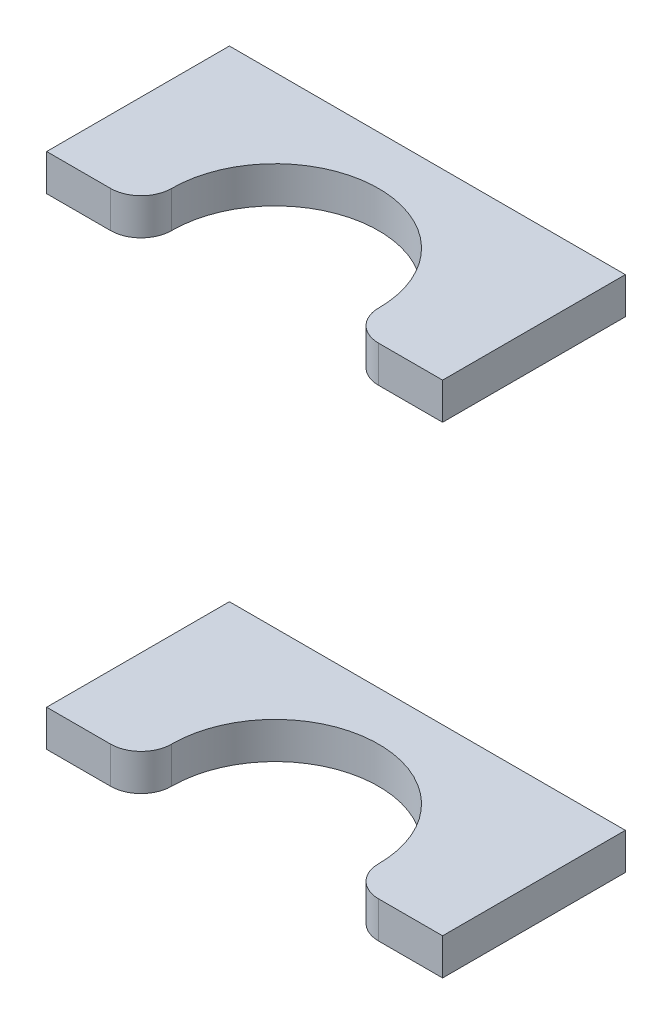
ISO-10303-21;
HEADER;
FILE_DESCRIPTION(('STEP AP214'),'2;1');
FILE_NAME('part.step','',(''),(''),'','','');
FILE_SCHEMA(('AUTOMOTIVE_DESIGN { 1 0 10303 214 1 1 1 1 }'));
ENDSEC;
DATA;
#1=APPLICATION_CONTEXT('core data for automotive mechanical design processes');
#2=APPLICATION_PROTOCOL_DEFINITION('international standard','automotive_design',2000,#1);
#3=PRODUCT_CONTEXT('',#1,'mechanical');
#4=PRODUCT('Part','Part','',(#3));
#5=PRODUCT_RELATED_PRODUCT_CATEGORY('part','',(#4));
#6=PRODUCT_DEFINITION_FORMATION('','',#4);
#7=PRODUCT_DEFINITION_CONTEXT('part definition',#1,'design');
#8=PRODUCT_DEFINITION('design','',#6,#7);
#9=PRODUCT_DEFINITION_SHAPE('','',#8);
#10=(LENGTH_UNIT() NAMED_UNIT(*) SI_UNIT(.MILLI.,.METRE.));
#11=(NAMED_UNIT(*) PLANE_ANGLE_UNIT() SI_UNIT($,.RADIAN.));
#12=(NAMED_UNIT(*) SI_UNIT($,.STERADIAN.) SOLID_ANGLE_UNIT());
#13=UNCERTAINTY_MEASURE_WITH_UNIT(LENGTH_MEASURE(1.E-05),#10,'distance_accuracy_value','');
#14=(GEOMETRIC_REPRESENTATION_CONTEXT(3) GLOBAL_UNCERTAINTY_ASSIGNED_CONTEXT((#13)) GLOBAL_UNIT_ASSIGNED_CONTEXT((#10,
#11,#12)) REPRESENTATION_CONTEXT('',''));
#15=CARTESIAN_POINT('',(0.,0.,0.));
#16=DIRECTION('',(0.,0.,1.));
#17=DIRECTION('',(1.,0.,0.));
#18=AXIS2_PLACEMENT_3D('',#15,#16,#17);
#19=CARTESIAN_POINT('',(-319.,105.,109.276335681472));
#20=DIRECTION('',(-1.,0.,0.));
#21=DIRECTION('',(0.,0.,1.));
#22=AXIS2_PLACEMENT_3D('',#19,#20,#21);
#23=PLANE('',#22);
#24=DIRECTION('',(0.,0.,-1.));
#25=VECTOR('',#24,1.);
#26=CARTESIAN_POINT('',(-319.,105.,109.276335681472));
#27=LINE('',#26,#25);
#28=CARTESIAN_POINT('',(-319.,105.,30.0000000000017));
#29=VERTEX_POINT('',#28);
#30=CARTESIAN_POINT('',(-319.,105.,0.));
#31=VERTEX_POINT('',#30);
#32=EDGE_CURVE('E82',#29,#31,#27,.T.);
#33=ORIENTED_EDGE('',*,*,#32,.F.);
#34=DIRECTION('',(0.,-1.,0.));
#35=VECTOR('',#34,1.);
#36=CARTESIAN_POINT('',(-319.,105.,30.0000000000017));
#37=LINE('',#36,#35);
#38=CARTESIAN_POINT('',(-319.,99.,30.0000000000017));
#39=VERTEX_POINT('',#38);
#40=EDGE_CURVE('E135',#29,#39,#37,.T.);
#41=ORIENTED_EDGE('',*,*,#40,.T.);
#42=DIRECTION('',(0.,0.,-1.));
#43=VECTOR('',#42,1.);
#44=CARTESIAN_POINT('',(-319.,99.,109.276335681472));
#45=LINE('',#44,#43);
#46=CARTESIAN_POINT('',(-319.,99.,0.));
#47=VERTEX_POINT('',#46);
#48=EDGE_CURVE('E90',#39,#47,#45,.T.);
#49=ORIENTED_EDGE('',*,*,#48,.T.);
#50=DIRECTION('',(0.,1.,0.));
#51=VECTOR('',#50,1.);
#52=CARTESIAN_POINT('',(-319.,105.,0.));
#53=LINE('',#52,#51);
#54=EDGE_CURVE('E184',#47,#31,#53,.T.);
#55=ORIENTED_EDGE('',*,*,#54,.T.);
#56=EDGE_LOOP('',(#33,#41,#49,#55));
#57=FACE_BOUND('',#56,.T.);
#58=ADVANCED_FACE('F46',(#57),#23,.F.);
#59=CARTESIAN_POINT('',(-319.,105.,109.276335681472));
#60=DIRECTION('',(0.,-1.,0.));
#61=DIRECTION('',(1.,0.,0.));
#62=AXIS2_PLACEMENT_3D('',#59,#60,#61);
#63=PLANE('',#62);
#64=DIRECTION('',(0.,0.,-1.));
#65=VECTOR('',#64,1.);
#66=CARTESIAN_POINT('',(-384.,105.,109.276335681472));
#67=LINE('',#66,#65);
#68=CARTESIAN_POINT('',(-384.,105.,30.0000000000017));
#69=VERTEX_POINT('',#68);
#70=CARTESIAN_POINT('',(-384.,105.,0.));
#71=VERTEX_POINT('',#70);
#72=EDGE_CURVE('E180',#69,#71,#67,.T.);
#73=ORIENTED_EDGE('',*,*,#72,.F.);
#74=DIRECTION('',(1.,0.,0.));
#75=VECTOR('',#74,1.);
#76=CARTESIAN_POINT('',(-373.5,105.,30.0000000000017));
#77=LINE('',#76,#75);
#78=CARTESIAN_POINT('',(-373.5,105.,30.0000000000017));
#79=VERTEX_POINT('',#78);
#80=EDGE_CURVE('E141',#69,#79,#77,.T.);
#81=ORIENTED_EDGE('',*,*,#80,.T.);
#82=CARTESIAN_POINT('',(-373.5,105.,25.0000000000017));
#83=DIRECTION('',(0.,1.,0.));
#84=DIRECTION('',(1.,0.,0.));
#85=AXIS2_PLACEMENT_3D('',#82,#83,#84);
#86=CIRCLE('',#85,4.99999999999998);
#87=CARTESIAN_POINT('',(-368.5,105.,25.0000000000017));
#88=VERTEX_POINT('',#87);
#89=EDGE_CURVE('E154',#79,#88,#86,.T.);
#90=ORIENTED_EDGE('',*,*,#89,.T.);
#91=CARTESIAN_POINT('',(-351.5,105.,25.0000000000017));
#92=DIRECTION('',(0.,-1.,0.));
#93=DIRECTION('',(1.,0.,0.));
#94=AXIS2_PLACEMENT_3D('',#91,#92,#93);
#95=CIRCLE('',#94,17.);
#96=CARTESIAN_POINT('',(-334.5,105.,25.0000000000017));
#97=VERTEX_POINT('',#96);
#98=EDGE_CURVE('E136',#88,#97,#95,.T.);
#99=ORIENTED_EDGE('',*,*,#98,.T.);
#100=CARTESIAN_POINT('',(-329.5,105.,25.0000000000017));
#101=DIRECTION('',(0.,1.,0.));
#102=DIRECTION('',(-1.,0.,0.));
#103=AXIS2_PLACEMENT_3D('',#100,#101,#102);
#104=CIRCLE('',#103,4.99999999999998);
#105=CARTESIAN_POINT('',(-329.5,105.,30.0000000000017));
#106=VERTEX_POINT('',#105);
#107=EDGE_CURVE('E129',#97,#106,#104,.T.);
#108=ORIENTED_EDGE('',*,*,#107,.T.);
#109=DIRECTION('',(1.,0.,0.));
#110=VECTOR('',#109,1.);
#111=CARTESIAN_POINT('',(-329.5,105.,30.0000000000017));
#112=LINE('',#111,#110);
#113=EDGE_CURVE('E138',#106,#29,#112,.T.);
#114=ORIENTED_EDGE('',*,*,#113,.T.);
#115=ORIENTED_EDGE('',*,*,#32,.T.);
#116=DIRECTION('',(-1.,0.,0.));
#117=VECTOR('',#116,1.);
#118=CARTESIAN_POINT('',(-319.,105.,0.));
#119=LINE('',#118,#117);
#120=EDGE_CURVE('E181',#31,#71,#119,.T.);
#121=ORIENTED_EDGE('',*,*,#120,.T.);
#122=EDGE_LOOP('',(#73,#81,#90,#99,#108,#114,#115,#121));
#123=FACE_BOUND('',#122,.T.);
#124=ADVANCED_FACE('F144',(#123),#63,.F.);
#125=CARTESIAN_POINT('',(-384.,105.,109.276335681472));
#126=DIRECTION('',(1.,0.,0.));
#127=DIRECTION('',(0.,1.,0.));
#128=AXIS2_PLACEMENT_3D('',#125,#126,#127);
#129=PLANE('',#128);
#130=DIRECTION('',(0.,0.,-1.));
#131=VECTOR('',#130,1.);
#132=CARTESIAN_POINT('',(-384.,99.,109.276335681472));
#133=LINE('',#132,#131);
#134=CARTESIAN_POINT('',(-384.,99.,30.0000000000017));
#135=VERTEX_POINT('',#134);
#136=CARTESIAN_POINT('',(-384.,99.,0.));
#137=VERTEX_POINT('',#136);
#138=EDGE_CURVE('E69',#135,#137,#133,.T.);
#139=ORIENTED_EDGE('',*,*,#138,.F.);
#140=DIRECTION('',(0.,-1.,0.));
#141=VECTOR('',#140,1.);
#142=CARTESIAN_POINT('',(-384.,105.,30.0000000000017));
#143=LINE('',#142,#141);
#144=EDGE_CURVE('E168',#69,#135,#143,.T.);
#145=ORIENTED_EDGE('',*,*,#144,.F.);
#146=ORIENTED_EDGE('',*,*,#72,.T.);
#147=DIRECTION('',(0.,-1.,0.));
#148=VECTOR('',#147,1.);
#149=CARTESIAN_POINT('',(-384.,105.,0.));
#150=LINE('',#149,#148);
#151=EDGE_CURVE('E177',#71,#137,#150,.T.);
#152=ORIENTED_EDGE('',*,*,#151,.T.);
#153=EDGE_LOOP('',(#139,#145,#146,#152));
#154=FACE_BOUND('',#153,.T.);
#155=ADVANCED_FACE('F211',(#154),#129,.F.);
#156=CARTESIAN_POINT('',(-319.,99.,109.276335681472));
#157=DIRECTION('',(0.,1.,0.));
#158=DIRECTION('',(-1.,0.,0.));
#159=AXIS2_PLACEMENT_3D('',#156,#157,#158);
#160=PLANE('',#159);
#161=CARTESIAN_POINT('',(-373.5,99.,25.0000000000017));
#162=DIRECTION('',(0.,1.,0.));
#163=DIRECTION('',(-1.,0.,0.));
#164=AXIS2_PLACEMENT_3D('',#161,#162,#163);
#165=CIRCLE('',#164,4.99999999999998);
#166=CARTESIAN_POINT('',(-368.5,99.,25.0000000000017));
#167=VERTEX_POINT('',#166);
#168=CARTESIAN_POINT('',(-373.5,99.,30.0000000000017));
#169=VERTEX_POINT('',#168);
#170=EDGE_CURVE('E54',#167,#169,#165,.F.);
#171=ORIENTED_EDGE('',*,*,#170,.T.);
#172=DIRECTION('',(-1.,0.,0.));
#173=VECTOR('',#172,1.);
#174=CARTESIAN_POINT('',(-319.,99.,30.0000000000017));
#175=LINE('',#174,#173);
#176=EDGE_CURVE('E12',#169,#135,#175,.T.);
#177=ORIENTED_EDGE('',*,*,#176,.T.);
#178=ORIENTED_EDGE('',*,*,#138,.T.);
#179=DIRECTION('',(1.,0.,0.));
#180=VECTOR('',#179,1.);
#181=CARTESIAN_POINT('',(-319.,99.,0.));
#182=LINE('',#181,#180);
#183=EDGE_CURVE('E173',#137,#47,#182,.T.);
#184=ORIENTED_EDGE('',*,*,#183,.T.);
#185=ORIENTED_EDGE('',*,*,#48,.F.);
#186=DIRECTION('',(-1.,0.,0.));
#187=VECTOR('',#186,1.);
#188=CARTESIAN_POINT('',(-319.,99.,30.0000000000017));
#189=LINE('',#188,#187);
#190=CARTESIAN_POINT('',(-329.5,99.,30.0000000000017));
#191=VERTEX_POINT('',#190);
#192=EDGE_CURVE('E176',#39,#191,#189,.T.);
#193=ORIENTED_EDGE('',*,*,#192,.T.);
#194=CARTESIAN_POINT('',(-329.5,99.,25.0000000000017));
#195=DIRECTION('',(0.,1.,0.));
#196=DIRECTION('',(-1.,0.,0.));
#197=AXIS2_PLACEMENT_3D('',#194,#195,#196);
#198=CIRCLE('',#197,4.99999999999998);
#199=CARTESIAN_POINT('',(-334.5,99.,25.0000000000017));
#200=VERTEX_POINT('',#199);
#201=EDGE_CURVE('E132',#191,#200,#198,.F.);
#202=ORIENTED_EDGE('',*,*,#201,.T.);
#203=CARTESIAN_POINT('',(-351.5,99.,25.0000000000017));
#204=DIRECTION('',(0.,1.,0.));
#205=DIRECTION('',(-1.,0.,0.));
#206=AXIS2_PLACEMENT_3D('',#203,#204,#205);
#207=CIRCLE('',#206,17.);
#208=EDGE_CURVE('E97',#200,#167,#207,.T.);
#209=ORIENTED_EDGE('',*,*,#208,.T.);
#210=EDGE_LOOP('',(#171,#177,#178,#184,#185,#193,#202,#209));
#211=FACE_BOUND('',#210,.T.);
#212=ADVANCED_FACE('F202',(#211),#160,.F.);
#213=CARTESIAN_POINT('',(0.,0.,0.));
#214=DIRECTION('',(0.,0.,-1.));
#215=DIRECTION('',(-1.,0.,0.));
#216=AXIS2_PLACEMENT_3D('',#213,#214,#215);
#217=PLANE('',#216);
#218=ORIENTED_EDGE('',*,*,#54,.F.);
#219=ORIENTED_EDGE('',*,*,#183,.F.);
#220=ORIENTED_EDGE('',*,*,#151,.F.);
#221=ORIENTED_EDGE('',*,*,#120,.F.);
#222=EDGE_LOOP('',(#218,#219,#220,#221));
#223=FACE_BOUND('',#222,.T.);
#224=ADVANCED_FACE('F216',(#223),#217,.T.);
#225=CARTESIAN_POINT('',(-329.5,105.,25.0000000000017));
#226=DIRECTION('',(0.,-1.,0.));
#227=DIRECTION('',(1.,0.,0.));
#228=AXIS2_PLACEMENT_3D('',#225,#226,#227);
#229=CYLINDRICAL_SURFACE('',#228,4.99999999999998);
#230=DIRECTION('',(0.,-1.,0.));
#231=VECTOR('',#230,1.);
#232=CARTESIAN_POINT('',(-329.5,105.,30.0000000000017));
#233=LINE('',#232,#231);
#234=EDGE_CURVE('E61',#106,#191,#233,.T.);
#235=ORIENTED_EDGE('',*,*,#234,.F.);
#236=ORIENTED_EDGE('',*,*,#107,.F.);
#237=DIRECTION('',(0.,-1.,0.));
#238=VECTOR('',#237,1.);
#239=CARTESIAN_POINT('',(-334.5,105.,25.0000000000017));
#240=LINE('',#239,#238);
#241=EDGE_CURVE('E159',#97,#200,#240,.T.);
#242=ORIENTED_EDGE('',*,*,#241,.T.);
#243=ORIENTED_EDGE('',*,*,#201,.F.);
#244=EDGE_LOOP('',(#235,#236,#242,#243));
#245=FACE_BOUND('',#244,.T.);
#246=ADVANCED_FACE('F127',(#245),#229,.T.);
#247=CARTESIAN_POINT('',(-351.5,105.,25.0000000000017));
#248=DIRECTION('',(0.,-1.,0.));
#249=DIRECTION('',(1.,0.,0.));
#250=AXIS2_PLACEMENT_3D('',#247,#248,#249);
#251=CYLINDRICAL_SURFACE('',#250,17.);
#252=ORIENTED_EDGE('',*,*,#241,.F.);
#253=ORIENTED_EDGE('',*,*,#98,.F.);
#254=DIRECTION('',(0.,-1.,0.));
#255=VECTOR('',#254,1.);
#256=CARTESIAN_POINT('',(-368.5,105.,25.0000000000017));
#257=LINE('',#256,#255);
#258=EDGE_CURVE('E162',#88,#167,#257,.T.);
#259=ORIENTED_EDGE('',*,*,#258,.T.);
#260=ORIENTED_EDGE('',*,*,#208,.F.);
#261=EDGE_LOOP('',(#252,#253,#259,#260));
#262=FACE_BOUND('',#261,.T.);
#263=ADVANCED_FACE('F206',(#262),#251,.F.);
#264=CARTESIAN_POINT('',(-373.5,105.,25.0000000000017));
#265=DIRECTION('',(0.,-1.,0.));
#266=DIRECTION('',(1.,0.,0.));
#267=AXIS2_PLACEMENT_3D('',#264,#265,#266);
#268=CYLINDRICAL_SURFACE('',#267,4.99999999999998);
#269=ORIENTED_EDGE('',*,*,#258,.F.);
#270=ORIENTED_EDGE('',*,*,#89,.F.);
#271=DIRECTION('',(0.,-1.,0.));
#272=VECTOR('',#271,1.);
#273=CARTESIAN_POINT('',(-373.5,105.,30.0000000000017));
#274=LINE('',#273,#272);
#275=EDGE_CURVE('E165',#79,#169,#274,.T.);
#276=ORIENTED_EDGE('',*,*,#275,.T.);
#277=ORIENTED_EDGE('',*,*,#170,.F.);
#278=EDGE_LOOP('',(#269,#270,#276,#277));
#279=FACE_BOUND('',#278,.T.);
#280=ADVANCED_FACE('F204',(#279),#268,.T.);
#281=CARTESIAN_POINT('',(-373.5,105.,30.0000000000017));
#282=DIRECTION('',(0.,0.,-1.));
#283=DIRECTION('',(-1.,0.,0.));
#284=AXIS2_PLACEMENT_3D('',#281,#282,#283);
#285=PLANE('',#284);
#286=ORIENTED_EDGE('',*,*,#275,.F.);
#287=ORIENTED_EDGE('',*,*,#80,.F.);
#288=ORIENTED_EDGE('',*,*,#144,.T.);
#289=ORIENTED_EDGE('',*,*,#176,.F.);
#290=EDGE_LOOP('',(#286,#287,#288,#289));
#291=FACE_BOUND('',#290,.T.);
#292=ADVANCED_FACE('F209',(#291),#285,.F.);
#293=CARTESIAN_POINT('',(-329.5,105.,30.0000000000017));
#294=DIRECTION('',(0.,0.,-1.));
#295=DIRECTION('',(-1.,0.,0.));
#296=AXIS2_PLACEMENT_3D('',#293,#294,#295);
#297=PLANE('',#296);
#298=ORIENTED_EDGE('',*,*,#40,.F.);
#299=ORIENTED_EDGE('',*,*,#113,.F.);
#300=ORIENTED_EDGE('',*,*,#234,.T.);
#301=ORIENTED_EDGE('',*,*,#192,.F.);
#302=EDGE_LOOP('',(#298,#299,#300,#301));
#303=FACE_BOUND('',#302,.T.);
#304=ADVANCED_FACE('F139',(#303),#297,.F.);
#305=CLOSED_SHELL('',(#58,#124,#155,#212,#224,#246,#263,#280,#292,#304));
#306=MANIFOLD_SOLID_BREP('B2',#305);
#307=CARTESIAN_POINT('',(-384.,20.,109.276335681472));
#308=DIRECTION('',(1.,0.,0.));
#309=DIRECTION('',(0.,1.,0.));
#310=AXIS2_PLACEMENT_3D('',#307,#308,#309);
#311=PLANE('',#310);
#312=DIRECTION('',(0.,0.,-1.));
#313=VECTOR('',#312,1.);
#314=CARTESIAN_POINT('',(-384.,20.,109.276335681472));
#315=LINE('',#314,#313);
#316=CARTESIAN_POINT('',(-384.,20.,30.0000000000017));
#317=VERTEX_POINT('',#316);
#318=CARTESIAN_POINT('',(-384.,20.,0.));
#319=VERTEX_POINT('',#318);
#320=EDGE_CURVE('E343',#317,#319,#315,.T.);
#321=ORIENTED_EDGE('',*,*,#320,.F.);
#322=DIRECTION('',(0.,-1.,0.));
#323=VECTOR('',#322,1.);
#324=CARTESIAN_POINT('',(-384.,105.,30.0000000000017));
#325=LINE('',#324,#323);
#326=CARTESIAN_POINT('',(-384.,26.,30.0000000000017));
#327=VERTEX_POINT('',#326);
#328=EDGE_CURVE('E429',#327,#317,#325,.T.);
#329=ORIENTED_EDGE('',*,*,#328,.F.);
#330=DIRECTION('',(0.,0.,-1.));
#331=VECTOR('',#330,1.);
#332=CARTESIAN_POINT('',(-384.,26.,109.276335681472));
#333=LINE('',#332,#331);
#334=CARTESIAN_POINT('',(-384.,26.,0.));
#335=VERTEX_POINT('',#334);
#336=EDGE_CURVE('E351',#327,#335,#333,.T.);
#337=ORIENTED_EDGE('',*,*,#336,.T.);
#338=DIRECTION('',(0.,-1.,0.));
#339=VECTOR('',#338,1.);
#340=CARTESIAN_POINT('',(-384.,20.,0.));
#341=LINE('',#340,#339);
#342=EDGE_CURVE('E442',#335,#319,#341,.T.);
#343=ORIENTED_EDGE('',*,*,#342,.T.);
#344=EDGE_LOOP('',(#321,#329,#337,#343));
#345=FACE_BOUND('',#344,.T.);
#346=ADVANCED_FACE('F307',(#345),#311,.F.);
#347=CARTESIAN_POINT('',(-319.,20.,109.276335681472));
#348=DIRECTION('',(0.,1.,0.));
#349=DIRECTION('',(-1.,0.,0.));
#350=AXIS2_PLACEMENT_3D('',#347,#348,#349);
#351=PLANE('',#350);
#352=CARTESIAN_POINT('',(-373.5,20.,25.0000000000017));
#353=DIRECTION('',(0.,1.,0.));
#354=DIRECTION('',(1.,0.,0.));
#355=AXIS2_PLACEMENT_3D('',#352,#353,#354);
#356=CIRCLE('',#355,4.99999999999998);
#357=CARTESIAN_POINT('',(-373.5,20.,30.0000000000017));
#358=VERTEX_POINT('',#357);
#359=CARTESIAN_POINT('',(-368.5,20.,25.0000000000017));
#360=VERTEX_POINT('',#359);
#361=EDGE_CURVE('E414',#358,#360,#356,.T.);
#362=ORIENTED_EDGE('',*,*,#361,.F.);
#363=DIRECTION('',(1.,0.,0.));
#364=VECTOR('',#363,1.);
#365=CARTESIAN_POINT('',(-373.5,20.,30.0000000000017));
#366=LINE('',#365,#364);
#367=EDGE_CURVE('E408',#317,#358,#366,.T.);
#368=ORIENTED_EDGE('',*,*,#367,.F.);
#369=ORIENTED_EDGE('',*,*,#320,.T.);
#370=DIRECTION('',(1.,0.,0.));
#371=VECTOR('',#370,1.);
#372=CARTESIAN_POINT('',(-319.,20.,0.));
#373=LINE('',#372,#371);
#374=CARTESIAN_POINT('',(-319.,20.,0.));
#375=VERTEX_POINT('',#374);
#376=EDGE_CURVE('E439',#319,#375,#373,.T.);
#377=ORIENTED_EDGE('',*,*,#376,.T.);
#378=DIRECTION('',(0.,0.,-1.));
#379=VECTOR('',#378,1.);
#380=CARTESIAN_POINT('',(-319.,20.,109.276335681472));
#381=LINE('',#380,#379);
#382=CARTESIAN_POINT('',(-319.,20.,30.0000000000017));
#383=VERTEX_POINT('',#382);
#384=EDGE_CURVE('E406',#383,#375,#381,.T.);
#385=ORIENTED_EDGE('',*,*,#384,.F.);
#386=DIRECTION('',(1.,0.,0.));
#387=VECTOR('',#386,1.);
#388=CARTESIAN_POINT('',(-329.5,20.,30.0000000000017));
#389=LINE('',#388,#387);
#390=CARTESIAN_POINT('',(-329.5,20.,30.0000000000017));
#391=VERTEX_POINT('',#390);
#392=EDGE_CURVE('E390',#391,#383,#389,.T.);
#393=ORIENTED_EDGE('',*,*,#392,.F.);
#394=CARTESIAN_POINT('',(-329.5,20.,25.0000000000017));
#395=DIRECTION('',(0.,1.,0.));
#396=DIRECTION('',(-1.,0.,0.));
#397=AXIS2_PLACEMENT_3D('',#394,#395,#396);
#398=CIRCLE('',#397,4.99999999999998);
#399=CARTESIAN_POINT('',(-334.5,20.,25.0000000000017));
#400=VERTEX_POINT('',#399);
#401=EDGE_CURVE('E396',#400,#391,#398,.T.);
#402=ORIENTED_EDGE('',*,*,#401,.F.);
#403=CARTESIAN_POINT('',(-351.5,20.,25.0000000000017));
#404=DIRECTION('',(0.,-1.,0.));
#405=DIRECTION('',(1.,0.,0.));
#406=AXIS2_PLACEMENT_3D('',#403,#404,#405);
#407=CIRCLE('',#406,17.);
#408=EDGE_CURVE('E393',#360,#400,#407,.T.);
#409=ORIENTED_EDGE('',*,*,#408,.F.);
#410=EDGE_LOOP('',(#362,#368,#369,#377,#385,#393,#402,#409));
#411=FACE_BOUND('',#410,.T.);
#412=ADVANCED_FACE('F405',(#411),#351,.F.);
#413=CARTESIAN_POINT('',(-319.,20.,109.276335681472));
#414=DIRECTION('',(-1.,0.,0.));
#415=DIRECTION('',(0.,0.,1.));
#416=AXIS2_PLACEMENT_3D('',#413,#414,#415);
#417=PLANE('',#416);
#418=DIRECTION('',(0.,0.,-1.));
#419=VECTOR('',#418,1.);
#420=CARTESIAN_POINT('',(-319.,26.,109.276335681472));
#421=LINE('',#420,#419);
#422=CARTESIAN_POINT('',(-319.,26.,30.0000000000017));
#423=VERTEX_POINT('',#422);
#424=CARTESIAN_POINT('',(-319.,26.,0.));
#425=VERTEX_POINT('',#424);
#426=EDGE_CURVE('E330',#423,#425,#421,.T.);
#427=ORIENTED_EDGE('',*,*,#426,.F.);
#428=DIRECTION('',(0.,-1.,0.));
#429=VECTOR('',#428,1.);
#430=CARTESIAN_POINT('',(-319.,105.,30.0000000000017));
#431=LINE('',#430,#429);
#432=EDGE_CURVE('E322',#423,#383,#431,.T.);
#433=ORIENTED_EDGE('',*,*,#432,.T.);
#434=ORIENTED_EDGE('',*,*,#384,.T.);
#435=DIRECTION('',(0.,1.,0.));
#436=VECTOR('',#435,1.);
#437=CARTESIAN_POINT('',(-319.,20.,0.));
#438=LINE('',#437,#436);
#439=EDGE_CURVE('E436',#375,#425,#438,.T.);
#440=ORIENTED_EDGE('',*,*,#439,.T.);
#441=EDGE_LOOP('',(#427,#433,#434,#440));
#442=FACE_BOUND('',#441,.T.);
#443=ADVANCED_FACE('F484',(#442),#417,.F.);
#444=CARTESIAN_POINT('',(-319.,26.,109.276335681472));
#445=DIRECTION('',(0.,-1.,0.));
#446=DIRECTION('',(1.,0.,0.));
#447=AXIS2_PLACEMENT_3D('',#444,#445,#446);
#448=PLANE('',#447);
#449=ORIENTED_EDGE('',*,*,#336,.F.);
#450=DIRECTION('',(1.,0.,0.));
#451=VECTOR('',#450,1.);
#452=CARTESIAN_POINT('',(-319.,26.,30.0000000000017));
#453=LINE('',#452,#451);
#454=CARTESIAN_POINT('',(-373.5,26.,30.0000000000017));
#455=VERTEX_POINT('',#454);
#456=EDGE_CURVE('E44',#327,#455,#453,.T.);
#457=ORIENTED_EDGE('',*,*,#456,.T.);
#458=CARTESIAN_POINT('',(-373.5,26.,25.0000000000017));
#459=DIRECTION('',(0.,-1.,0.));
#460=DIRECTION('',(1.,0.,0.));
#461=AXIS2_PLACEMENT_3D('',#458,#459,#460);
#462=CIRCLE('',#461,4.99999999999998);
#463=CARTESIAN_POINT('',(-368.5,26.,25.0000000000017));
#464=VERTEX_POINT('',#463);
#465=EDGE_CURVE('E315',#455,#464,#462,.F.);
#466=ORIENTED_EDGE('',*,*,#465,.T.);
#467=CARTESIAN_POINT('',(-351.5,26.,25.0000000000017));
#468=DIRECTION('',(0.,-1.,0.));
#469=DIRECTION('',(1.,0.,0.));
#470=AXIS2_PLACEMENT_3D('',#467,#468,#469);
#471=CIRCLE('',#470,17.);
#472=CARTESIAN_POINT('',(-334.5,26.,25.0000000000017));
#473=VERTEX_POINT('',#472);
#474=EDGE_CURVE('E457',#464,#473,#471,.T.);
#475=ORIENTED_EDGE('',*,*,#474,.T.);
#476=CARTESIAN_POINT('',(-329.5,26.,25.0000000000017));
#477=DIRECTION('',(0.,-1.,0.));
#478=DIRECTION('',(1.,0.,0.));
#479=AXIS2_PLACEMENT_3D('',#476,#477,#478);
#480=CIRCLE('',#479,4.99999999999998);
#481=CARTESIAN_POINT('',(-329.5,26.,30.0000000000017));
#482=VERTEX_POINT('',#481);
#483=EDGE_CURVE('E358',#473,#482,#480,.F.);
#484=ORIENTED_EDGE('',*,*,#483,.T.);
#485=DIRECTION('',(1.,0.,0.));
#486=VECTOR('',#485,1.);
#487=CARTESIAN_POINT('',(-319.,26.,30.0000000000017));
#488=LINE('',#487,#486);
#489=EDGE_CURVE('E391',#482,#423,#488,.T.);
#490=ORIENTED_EDGE('',*,*,#489,.T.);
#491=ORIENTED_EDGE('',*,*,#426,.T.);
#492=DIRECTION('',(-1.,0.,0.));
#493=VECTOR('',#492,1.);
#494=CARTESIAN_POINT('',(-319.,26.,0.));
#495=LINE('',#494,#493);
#496=EDGE_CURVE('E433',#425,#335,#495,.T.);
#497=ORIENTED_EDGE('',*,*,#496,.T.);
#498=EDGE_LOOP('',(#449,#457,#466,#475,#484,#490,#491,#497));
#499=FACE_BOUND('',#498,.T.);
#500=ADVANCED_FACE('F462',(#499),#448,.F.);
#501=CARTESIAN_POINT('',(0.,0.,0.));
#502=DIRECTION('',(0.,0.,1.));
#503=DIRECTION('',(1.,0.,0.));
#504=AXIS2_PLACEMENT_3D('',#501,#502,#503);
#505=PLANE('',#504);
#506=ORIENTED_EDGE('',*,*,#342,.F.);
#507=ORIENTED_EDGE('',*,*,#496,.F.);
#508=ORIENTED_EDGE('',*,*,#439,.F.);
#509=ORIENTED_EDGE('',*,*,#376,.F.);
#510=EDGE_LOOP('',(#506,#507,#508,#509));
#511=FACE_BOUND('',#510,.T.);
#512=ADVANCED_FACE('F478',(#511),#505,.F.);
#513=CARTESIAN_POINT('',(-329.5,105.,25.0000000000017));
#514=DIRECTION('',(0.,-1.,0.));
#515=DIRECTION('',(1.,0.,0.));
#516=AXIS2_PLACEMENT_3D('',#513,#514,#515);
#517=CYLINDRICAL_SURFACE('',#516,4.99999999999998);
#518=DIRECTION('',(0.,-1.,0.));
#519=VECTOR('',#518,1.);
#520=CARTESIAN_POINT('',(-334.5,105.,25.0000000000017));
#521=LINE('',#520,#519);
#522=EDGE_CURVE('E398',#473,#400,#521,.T.);
#523=ORIENTED_EDGE('',*,*,#522,.T.);
#524=ORIENTED_EDGE('',*,*,#401,.T.);
#525=DIRECTION('',(0.,-1.,0.));
#526=VECTOR('',#525,1.);
#527=CARTESIAN_POINT('',(-329.5,105.,30.0000000000017));
#528=LINE('',#527,#526);
#529=EDGE_CURVE('E386',#482,#391,#528,.T.);
#530=ORIENTED_EDGE('',*,*,#529,.F.);
#531=ORIENTED_EDGE('',*,*,#483,.F.);
#532=EDGE_LOOP('',(#523,#524,#530,#531));
#533=FACE_BOUND('',#532,.T.);
#534=ADVANCED_FACE('F397',(#533),#517,.T.);
#535=CARTESIAN_POINT('',(-351.5,105.,25.0000000000017));
#536=DIRECTION('',(0.,-1.,0.));
#537=DIRECTION('',(1.,0.,0.));
#538=AXIS2_PLACEMENT_3D('',#535,#536,#537);
#539=CYLINDRICAL_SURFACE('',#538,17.);
#540=DIRECTION('',(0.,-1.,0.));
#541=VECTOR('',#540,1.);
#542=CARTESIAN_POINT('',(-368.5,105.,25.0000000000017));
#543=LINE('',#542,#541);
#544=EDGE_CURVE('E423',#464,#360,#543,.T.);
#545=ORIENTED_EDGE('',*,*,#544,.T.);
#546=ORIENTED_EDGE('',*,*,#408,.T.);
#547=ORIENTED_EDGE('',*,*,#522,.F.);
#548=ORIENTED_EDGE('',*,*,#474,.F.);
#549=EDGE_LOOP('',(#545,#546,#547,#548));
#550=FACE_BOUND('',#549,.T.);
#551=ADVANCED_FACE('F470',(#550),#539,.F.);
#552=CARTESIAN_POINT('',(-373.5,105.,25.0000000000017));
#553=DIRECTION('',(0.,-1.,0.));
#554=DIRECTION('',(1.,0.,0.));
#555=AXIS2_PLACEMENT_3D('',#552,#553,#554);
#556=CYLINDRICAL_SURFACE('',#555,4.99999999999998);
#557=DIRECTION('',(0.,-1.,0.));
#558=VECTOR('',#557,1.);
#559=CARTESIAN_POINT('',(-373.5,105.,30.0000000000017));
#560=LINE('',#559,#558);
#561=EDGE_CURVE('E426',#455,#358,#560,.T.);
#562=ORIENTED_EDGE('',*,*,#561,.T.);
#563=ORIENTED_EDGE('',*,*,#361,.T.);
#564=ORIENTED_EDGE('',*,*,#544,.F.);
#565=ORIENTED_EDGE('',*,*,#465,.F.);
#566=EDGE_LOOP('',(#562,#563,#564,#565));
#567=FACE_BOUND('',#566,.T.);
#568=ADVANCED_FACE('F466',(#567),#556,.T.);
#569=CARTESIAN_POINT('',(-373.5,105.,30.0000000000017));
#570=DIRECTION('',(0.,0.,-1.));
#571=DIRECTION('',(-1.,0.,0.));
#572=AXIS2_PLACEMENT_3D('',#569,#570,#571);
#573=PLANE('',#572);
#574=ORIENTED_EDGE('',*,*,#328,.T.);
#575=ORIENTED_EDGE('',*,*,#367,.T.);
#576=ORIENTED_EDGE('',*,*,#561,.F.);
#577=ORIENTED_EDGE('',*,*,#456,.F.);
#578=EDGE_LOOP('',(#574,#575,#576,#577));
#579=FACE_BOUND('',#578,.T.);
#580=ADVANCED_FACE('F468',(#579),#573,.F.);
#581=CARTESIAN_POINT('',(-329.5,105.,30.0000000000017));
#582=DIRECTION('',(0.,0.,-1.));
#583=DIRECTION('',(-1.,0.,0.));
#584=AXIS2_PLACEMENT_3D('',#581,#582,#583);
#585=PLANE('',#584);
#586=ORIENTED_EDGE('',*,*,#529,.T.);
#587=ORIENTED_EDGE('',*,*,#392,.T.);
#588=ORIENTED_EDGE('',*,*,#432,.F.);
#589=ORIENTED_EDGE('',*,*,#489,.F.);
#590=EDGE_LOOP('',(#586,#587,#588,#589));
#591=FACE_BOUND('',#590,.T.);
#592=ADVANCED_FACE('F388',(#591),#585,.F.);
#593=CLOSED_SHELL('',(#346,#412,#443,#500,#512,#534,#551,#568,#580,#592));
#594=MANIFOLD_SOLID_BREP('B6',#593);
#595=ADVANCED_BREP_SHAPE_REPRESENTATION('',(#18,#306,#594),#14);
#596=SHAPE_DEFINITION_REPRESENTATION(#9,#595);
ENDSEC;
END-ISO-10303-21;
